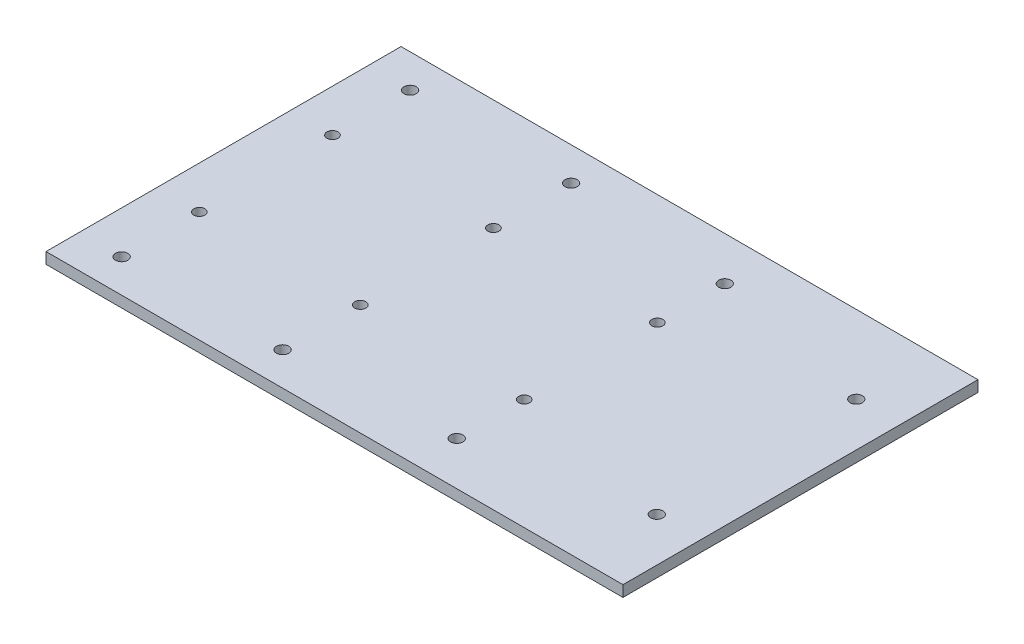
ISO-10303-21;
HEADER;
FILE_DESCRIPTION(('STEP AP214'),'2;1');
FILE_NAME('part.step','',(''),(''),'','','');
FILE_SCHEMA(('AUTOMOTIVE_DESIGN { 1 0 10303 214 1 1 1 1 }'));
ENDSEC;
DATA;
#1=APPLICATION_CONTEXT('core data for automotive mechanical design processes');
#2=APPLICATION_PROTOCOL_DEFINITION('international standard','automotive_design',2000,#1);
#3=PRODUCT_CONTEXT('',#1,'mechanical');
#4=PRODUCT('Part','Part','',(#3));
#5=PRODUCT_RELATED_PRODUCT_CATEGORY('part','',(#4));
#6=PRODUCT_DEFINITION_FORMATION('','',#4);
#7=PRODUCT_DEFINITION_CONTEXT('part definition',#1,'design');
#8=PRODUCT_DEFINITION('design','',#6,#7);
#9=PRODUCT_DEFINITION_SHAPE('','',#8);
#10=(LENGTH_UNIT() NAMED_UNIT(*) SI_UNIT(.MILLI.,.METRE.));
#11=(NAMED_UNIT(*) PLANE_ANGLE_UNIT() SI_UNIT($,.RADIAN.));
#12=(NAMED_UNIT(*) SI_UNIT($,.STERADIAN.) SOLID_ANGLE_UNIT());
#13=UNCERTAINTY_MEASURE_WITH_UNIT(LENGTH_MEASURE(1.E-05),#10,'distance_accuracy_value','');
#14=(GEOMETRIC_REPRESENTATION_CONTEXT(3) GLOBAL_UNCERTAINTY_ASSIGNED_CONTEXT((#13)) GLOBAL_UNIT_ASSIGNED_CONTEXT((#10,
#11,#12)) REPRESENTATION_CONTEXT('',''));
#15=CARTESIAN_POINT('',(0.,0.,0.));
#16=DIRECTION('',(0.,0.,1.));
#17=DIRECTION('',(1.,0.,0.));
#18=AXIS2_PLACEMENT_3D('',#15,#16,#17);
#19=CARTESIAN_POINT('',(165.1,6.35,101.6));
#20=DIRECTION('',(-1.,0.,0.));
#21=DIRECTION('',(0.,0.,1.));
#22=AXIS2_PLACEMENT_3D('',#19,#20,#21);
#23=PLANE('',#22);
#24=DIRECTION('',(0.,0.,-1.));
#25=VECTOR('',#24,1.);
#26=CARTESIAN_POINT('',(165.1,0.,101.6));
#27=LINE('',#26,#25);
#28=CARTESIAN_POINT('',(165.1,0.,101.6));
#29=VERTEX_POINT('',#28);
#30=CARTESIAN_POINT('',(165.1,0.,-101.6));
#31=VERTEX_POINT('',#30);
#32=EDGE_CURVE('E95',#29,#31,#27,.T.);
#33=ORIENTED_EDGE('',*,*,#32,.T.);
#34=DIRECTION('',(0.,-1.,0.));
#35=VECTOR('',#34,1.);
#36=CARTESIAN_POINT('',(165.1,6.35,-101.6));
#37=LINE('',#36,#35);
#38=CARTESIAN_POINT('',(165.1,6.35,-101.6));
#39=VERTEX_POINT('',#38);
#40=EDGE_CURVE('E11',#39,#31,#37,.T.);
#41=ORIENTED_EDGE('',*,*,#40,.F.);
#42=DIRECTION('',(0.,0.,-1.));
#43=VECTOR('',#42,1.);
#44=CARTESIAN_POINT('',(165.1,6.35,101.6));
#45=LINE('',#44,#43);
#46=CARTESIAN_POINT('',(165.1,6.35,101.6));
#47=VERTEX_POINT('',#46);
#48=EDGE_CURVE('E83',#47,#39,#45,.T.);
#49=ORIENTED_EDGE('',*,*,#48,.F.);
#50=DIRECTION('',(0.,-1.,0.));
#51=VECTOR('',#50,1.);
#52=CARTESIAN_POINT('',(165.1,6.35,101.6));
#53=LINE('',#52,#51);
#54=EDGE_CURVE('E91',#47,#29,#53,.T.);
#55=ORIENTED_EDGE('',*,*,#54,.T.);
#56=EDGE_LOOP('',(#33,#41,#49,#55));
#57=FACE_BOUND('',#56,.T.);
#58=ADVANCED_FACE('F32',(#57),#23,.F.);
#59=CARTESIAN_POINT('',(-165.1,6.35,-101.6));
#60=DIRECTION('',(0.,0.,1.));
#61=DIRECTION('',(1.,0.,0.));
#62=AXIS2_PLACEMENT_3D('',#59,#60,#61);
#63=PLANE('',#62);
#64=DIRECTION('',(-1.,0.,0.));
#65=VECTOR('',#64,1.);
#66=CARTESIAN_POINT('',(-165.1,0.,-101.6));
#67=LINE('',#66,#65);
#68=CARTESIAN_POINT('',(-165.1,0.,-101.6));
#69=VERTEX_POINT('',#68);
#70=EDGE_CURVE('E87',#31,#69,#67,.T.);
#71=ORIENTED_EDGE('',*,*,#70,.T.);
#72=DIRECTION('',(0.,-1.,0.));
#73=VECTOR('',#72,1.);
#74=CARTESIAN_POINT('',(-165.1,6.35,-101.6));
#75=LINE('',#74,#73);
#76=CARTESIAN_POINT('',(-165.1,6.35,-101.6));
#77=VERTEX_POINT('',#76);
#78=EDGE_CURVE('E40',#77,#69,#75,.T.);
#79=ORIENTED_EDGE('',*,*,#78,.F.);
#80=DIRECTION('',(-1.,0.,0.));
#81=VECTOR('',#80,1.);
#82=CARTESIAN_POINT('',(-165.1,6.35,-101.6));
#83=LINE('',#82,#81);
#84=EDGE_CURVE('E78',#39,#77,#83,.T.);
#85=ORIENTED_EDGE('',*,*,#84,.F.);
#86=ORIENTED_EDGE('',*,*,#40,.T.);
#87=EDGE_LOOP('',(#71,#79,#85,#86));
#88=FACE_BOUND('',#87,.T.);
#89=ADVANCED_FACE('F86',(#88),#63,.F.);
#90=CARTESIAN_POINT('',(-165.1,6.35,101.6));
#91=DIRECTION('',(1.,0.,0.));
#92=DIRECTION('',(0.,0.,-1.));
#93=AXIS2_PLACEMENT_3D('',#90,#91,#92);
#94=PLANE('',#93);
#95=DIRECTION('',(0.,0.,1.));
#96=VECTOR('',#95,1.);
#97=CARTESIAN_POINT('',(-165.1,0.,101.6));
#98=LINE('',#97,#96);
#99=CARTESIAN_POINT('',(-165.1,0.,101.6));
#100=VERTEX_POINT('',#99);
#101=EDGE_CURVE('E65',#69,#100,#98,.T.);
#102=ORIENTED_EDGE('',*,*,#101,.T.);
#103=DIRECTION('',(0.,-1.,0.));
#104=VECTOR('',#103,1.);
#105=CARTESIAN_POINT('',(-165.1,6.35,101.6));
#106=LINE('',#105,#104);
#107=CARTESIAN_POINT('',(-165.1,6.35,101.6));
#108=VERTEX_POINT('',#107);
#109=EDGE_CURVE('E88',#108,#100,#106,.T.);
#110=ORIENTED_EDGE('',*,*,#109,.F.);
#111=DIRECTION('',(0.,0.,1.));
#112=VECTOR('',#111,1.);
#113=CARTESIAN_POINT('',(-165.1,6.35,101.6));
#114=LINE('',#113,#112);
#115=EDGE_CURVE('E81',#77,#108,#114,.T.);
#116=ORIENTED_EDGE('',*,*,#115,.F.);
#117=ORIENTED_EDGE('',*,*,#78,.T.);
#118=EDGE_LOOP('',(#102,#110,#116,#117));
#119=FACE_BOUND('',#118,.T.);
#120=ADVANCED_FACE('F89',(#119),#94,.F.);
#121=CARTESIAN_POINT('',(-165.1,6.35,101.6));
#122=DIRECTION('',(0.,0.,-1.));
#123=DIRECTION('',(-1.,0.,0.));
#124=AXIS2_PLACEMENT_3D('',#121,#122,#123);
#125=PLANE('',#124);
#126=DIRECTION('',(1.,0.,0.));
#127=VECTOR('',#126,1.);
#128=CARTESIAN_POINT('',(-165.1,0.,101.6));
#129=LINE('',#128,#127);
#130=EDGE_CURVE('E71',#100,#29,#129,.T.);
#131=ORIENTED_EDGE('',*,*,#130,.T.);
#132=ORIENTED_EDGE('',*,*,#54,.F.);
#133=DIRECTION('',(1.,0.,0.));
#134=VECTOR('',#133,1.);
#135=CARTESIAN_POINT('',(-165.1,6.35,101.6));
#136=LINE('',#135,#134);
#137=EDGE_CURVE('E48',#108,#47,#136,.T.);
#138=ORIENTED_EDGE('',*,*,#137,.F.);
#139=ORIENTED_EDGE('',*,*,#109,.T.);
#140=EDGE_LOOP('',(#131,#132,#138,#139));
#141=FACE_BOUND('',#140,.T.);
#142=ADVANCED_FACE('F103',(#141),#125,.F.);
#143=CARTESIAN_POINT('',(0.,6.35,0.));
#144=DIRECTION('',(0.,-1.,0.));
#145=DIRECTION('',(0.,0.,-1.));
#146=AXIS2_PLACEMENT_3D('',#143,#144,#145);
#147=PLANE('',#146);
#148=CARTESIAN_POINT('',(-140.851562594,6.35,-82.5499999999999));
#149=DIRECTION('',(0.,1.,0.));
#150=DIRECTION('',(0.,0.,1.));
#151=AXIS2_PLACEMENT_3D('',#148,#149,#150);
#152=CIRCLE('',#151,3.5);
#153=CARTESIAN_POINT('',(-140.851562594,6.35,-79.0499999999999));
#154=VERTEX_POINT('',#153);
#155=EDGE_CURVE('E189',#154,#154,#152,.T.);
#156=ORIENTED_EDGE('',*,*,#155,.F.);
#157=EDGE_LOOP('',(#156));
#158=FACE_BOUND('',#157,.T.);
#159=CARTESIAN_POINT('',(-48.7159251880002,6.35,-82.5499999999999));
#160=DIRECTION('',(0.,1.,0.));
#161=DIRECTION('',(0.,0.,1.));
#162=AXIS2_PLACEMENT_3D('',#159,#160,#161);
#163=CIRCLE('',#162,3.5);
#164=CARTESIAN_POINT('',(-48.7159251880002,6.35,-79.05));
#165=VERTEX_POINT('',#164);
#166=EDGE_CURVE('E183',#165,#165,#163,.T.);
#167=ORIENTED_EDGE('',*,*,#166,.F.);
#168=EDGE_LOOP('',(#167));
#169=FACE_BOUND('',#168,.T.);
#170=CARTESIAN_POINT('',(45.084074812,6.35,-76.7010000288686));
#171=DIRECTION('',(0.,1.,0.));
#172=DIRECTION('',(0.,0.,1.));
#173=AXIS2_PLACEMENT_3D('',#170,#171,#172);
#174=CIRCLE('',#173,3.5);
#175=CARTESIAN_POINT('',(45.084074812,6.35,-73.2010000288686));
#176=VERTEX_POINT('',#175);
#177=EDGE_CURVE('E177',#176,#176,#174,.T.);
#178=ORIENTED_EDGE('',*,*,#177,.F.);
#179=EDGE_LOOP('',(#178));
#180=FACE_BOUND('',#179,.T.);
#181=CARTESIAN_POINT('',(45.084074812,6.35,76.6989999711314));
#182=DIRECTION('',(0.,1.,0.));
#183=DIRECTION('',(0.,0.,1.));
#184=AXIS2_PLACEMENT_3D('',#181,#182,#183);
#185=CIRCLE('',#184,3.5);
#186=CARTESIAN_POINT('',(45.084074812,6.35,80.1989999711314));
#187=VERTEX_POINT('',#186);
#188=EDGE_CURVE('E171',#187,#187,#185,.T.);
#189=ORIENTED_EDGE('',*,*,#188,.F.);
#190=EDGE_LOOP('',(#189));
#191=FACE_BOUND('',#190,.T.);
#192=CARTESIAN_POINT('',(-48.715925188,6.35,82.5500000000001));
#193=DIRECTION('',(0.,1.,0.));
#194=DIRECTION('',(0.,0.,1.));
#195=AXIS2_PLACEMENT_3D('',#192,#193,#194);
#196=CIRCLE('',#195,3.5);
#197=CARTESIAN_POINT('',(-48.715925188,6.35,86.0500000000001));
#198=VERTEX_POINT('',#197);
#199=EDGE_CURVE('E165',#198,#198,#196,.T.);
#200=ORIENTED_EDGE('',*,*,#199,.F.);
#201=EDGE_LOOP('',(#200));
#202=FACE_BOUND('',#201,.T.);
#203=CARTESIAN_POINT('',(-140.851562594,6.35,82.5500000000002));
#204=DIRECTION('',(0.,1.,0.));
#205=DIRECTION('',(0.,0.,1.));
#206=AXIS2_PLACEMENT_3D('',#203,#204,#205);
#207=CIRCLE('',#206,3.5);
#208=CARTESIAN_POINT('',(-140.851562594,6.35,86.0500000000002));
#209=VERTEX_POINT('',#208);
#210=EDGE_CURVE('E159',#209,#209,#207,.T.);
#211=ORIENTED_EDGE('',*,*,#210,.F.);
#212=EDGE_LOOP('',(#211));
#213=FACE_BOUND('',#212,.T.);
#214=CARTESIAN_POINT('',(139.954074812,6.35,-57.0720427209116));
#215=DIRECTION('',(0.,1.,0.));
#216=DIRECTION('',(0.,0.,1.));
#217=AXIS2_PLACEMENT_3D('',#214,#215,#216);
#218=CIRCLE('',#217,3.5);
#219=CARTESIAN_POINT('',(139.954074812,6.35,-53.5720427209116));
#220=VERTEX_POINT('',#219);
#221=EDGE_CURVE('E153',#220,#220,#218,.T.);
#222=ORIENTED_EDGE('',*,*,#221,.F.);
#223=EDGE_LOOP('',(#222));
#224=FACE_BOUND('',#223,.T.);
#225=CARTESIAN_POINT('',(139.954074812,6.35,57.0720427209118));
#226=DIRECTION('',(0.,1.,0.));
#227=DIRECTION('',(0.,0.,1.));
#228=AXIS2_PLACEMENT_3D('',#225,#226,#227);
#229=CIRCLE('',#228,3.5);
#230=CARTESIAN_POINT('',(139.954074812,6.35,60.5720427209118));
#231=VERTEX_POINT('',#230);
#232=EDGE_CURVE('E147',#231,#231,#229,.T.);
#233=ORIENTED_EDGE('',*,*,#232,.F.);
#234=EDGE_LOOP('',(#233));
#235=FACE_BOUND('',#234,.T.);
#236=CARTESIAN_POINT('',(-140.851767509531,6.35,-38.0999999994488));
#237=DIRECTION('',(0.,1.,0.));
#238=DIRECTION('',(0.,0.,1.));
#239=AXIS2_PLACEMENT_3D('',#236,#237,#238);
#240=CIRCLE('',#239,3.17499999999998);
#241=CARTESIAN_POINT('',(-140.851767509531,6.35,-34.9249999994488));
#242=VERTEX_POINT('',#241);
#243=EDGE_CURVE('E141',#242,#242,#240,.T.);
#244=ORIENTED_EDGE('',*,*,#243,.F.);
#245=EDGE_LOOP('',(#244));
#246=FACE_BOUND('',#245,.T.);
#247=CARTESIAN_POINT('',(-140.851357678469,6.35,38.0999999994491));
#248=DIRECTION('',(0.,1.,0.));
#249=DIRECTION('',(0.,0.,1.));
#250=AXIS2_PLACEMENT_3D('',#247,#248,#249);
#251=CIRCLE('',#250,3.17499999999998);
#252=CARTESIAN_POINT('',(-140.851357678469,6.35,41.2749999994491));
#253=VERTEX_POINT('',#252);
#254=EDGE_CURVE('E135',#253,#253,#251,.T.);
#255=ORIENTED_EDGE('',*,*,#254,.F.);
#256=EDGE_LOOP('',(#255));
#257=FACE_BOUND('',#256,.T.);
#258=CARTESIAN_POINT('',(-48.7159251880001,6.35,38.0995044618878));
#259=DIRECTION('',(0.,1.,0.));
#260=DIRECTION('',(0.,0.,1.));
#261=AXIS2_PLACEMENT_3D('',#258,#259,#260);
#262=CIRCLE('',#261,3.17499999999998);
#263=CARTESIAN_POINT('',(-48.7159251880001,6.35,41.2745044618878));
#264=VERTEX_POINT('',#263);
#265=EDGE_CURVE('E129',#264,#264,#262,.T.);
#266=ORIENTED_EDGE('',*,*,#265,.F.);
#267=EDGE_LOOP('',(#266));
#268=FACE_BOUND('',#267,.T.);
#269=CARTESIAN_POINT('',(-48.7159251880002,6.35,-38.1004955392143));
#270=DIRECTION('',(0.,1.,0.));
#271=DIRECTION('',(0.,0.,1.));
#272=AXIS2_PLACEMENT_3D('',#269,#270,#271);
#273=CIRCLE('',#272,3.17499999999998);
#274=CARTESIAN_POINT('',(-48.7159251880002,6.35,-34.9254955392144));
#275=VERTEX_POINT('',#274);
#276=EDGE_CURVE('E123',#275,#275,#273,.T.);
#277=ORIENTED_EDGE('',*,*,#276,.F.);
#278=EDGE_LOOP('',(#277));
#279=FACE_BOUND('',#278,.T.);
#280=CARTESIAN_POINT('',(45.0838698964688,6.35,-38.1010000283175));
#281=DIRECTION('',(0.,1.,0.));
#282=DIRECTION('',(0.,0.,1.));
#283=AXIS2_PLACEMENT_3D('',#280,#281,#282);
#284=CIRCLE('',#283,3.17499999999998);
#285=CARTESIAN_POINT('',(45.0838698964688,6.35,-34.9260000283176));
#286=VERTEX_POINT('',#285);
#287=EDGE_CURVE('E117',#286,#286,#284,.T.);
#288=ORIENTED_EDGE('',*,*,#287,.F.);
#289=EDGE_LOOP('',(#288));
#290=FACE_BOUND('',#289,.T.);
#291=CARTESIAN_POINT('',(45.0842797275312,6.35,38.0989999705804));
#292=DIRECTION('',(0.,1.,0.));
#293=DIRECTION('',(0.,0.,1.));
#294=AXIS2_PLACEMENT_3D('',#291,#292,#293);
#295=CIRCLE('',#294,3.17499999999998);
#296=CARTESIAN_POINT('',(45.0842797275312,6.35,41.2739999705803));
#297=VERTEX_POINT('',#296);
#298=EDGE_CURVE('E111',#297,#297,#295,.T.);
#299=ORIENTED_EDGE('',*,*,#298,.F.);
#300=EDGE_LOOP('',(#299));
#301=FACE_BOUND('',#300,.T.);
#302=ORIENTED_EDGE('',*,*,#48,.T.);
#303=ORIENTED_EDGE('',*,*,#84,.T.);
#304=ORIENTED_EDGE('',*,*,#115,.T.);
#305=ORIENTED_EDGE('',*,*,#137,.T.);
#306=EDGE_LOOP('',(#302,#303,#304,#305));
#307=FACE_BOUND('',#306,.T.);
#308=ADVANCED_FACE('F79',(#158,#169,#180,#191,#202,#213,#224,#235,#246,#257,#268,#279,#290,#301,
#307),#147,.F.);
#309=CARTESIAN_POINT('',(0.,0.,0.));
#310=DIRECTION('',(0.,-1.,0.));
#311=DIRECTION('',(0.,0.,-1.));
#312=AXIS2_PLACEMENT_3D('',#309,#310,#311);
#313=PLANE('',#312);
#314=CARTESIAN_POINT('',(-140.851562594,0.,-82.5499999999999));
#315=DIRECTION('',(0.,1.,0.));
#316=DIRECTION('',(0.,0.,1.));
#317=AXIS2_PLACEMENT_3D('',#314,#315,#316);
#318=CIRCLE('',#317,3.5);
#319=CARTESIAN_POINT('',(-140.851562594,0.,-79.0499999999999));
#320=VERTEX_POINT('',#319);
#321=EDGE_CURVE('E186',#320,#320,#318,.T.);
#322=ORIENTED_EDGE('',*,*,#321,.T.);
#323=EDGE_LOOP('',(#322));
#324=FACE_BOUND('',#323,.T.);
#325=CARTESIAN_POINT('',(-48.7159251880002,0.,-82.5499999999999));
#326=DIRECTION('',(0.,1.,0.));
#327=DIRECTION('',(0.,0.,1.));
#328=AXIS2_PLACEMENT_3D('',#325,#326,#327);
#329=CIRCLE('',#328,3.5);
#330=CARTESIAN_POINT('',(-48.7159251880002,0.,-79.05));
#331=VERTEX_POINT('',#330);
#332=EDGE_CURVE('E180',#331,#331,#329,.T.);
#333=ORIENTED_EDGE('',*,*,#332,.T.);
#334=EDGE_LOOP('',(#333));
#335=FACE_BOUND('',#334,.T.);
#336=CARTESIAN_POINT('',(45.084074812,0.,-76.7010000288686));
#337=DIRECTION('',(0.,1.,0.));
#338=DIRECTION('',(0.,0.,1.));
#339=AXIS2_PLACEMENT_3D('',#336,#337,#338);
#340=CIRCLE('',#339,3.5);
#341=CARTESIAN_POINT('',(45.084074812,0.,-73.2010000288686));
#342=VERTEX_POINT('',#341);
#343=EDGE_CURVE('E174',#342,#342,#340,.T.);
#344=ORIENTED_EDGE('',*,*,#343,.T.);
#345=EDGE_LOOP('',(#344));
#346=FACE_BOUND('',#345,.T.);
#347=CARTESIAN_POINT('',(45.084074812,0.,76.6989999711314));
#348=DIRECTION('',(0.,1.,0.));
#349=DIRECTION('',(0.,0.,1.));
#350=AXIS2_PLACEMENT_3D('',#347,#348,#349);
#351=CIRCLE('',#350,3.5);
#352=CARTESIAN_POINT('',(45.084074812,0.,80.1989999711314));
#353=VERTEX_POINT('',#352);
#354=EDGE_CURVE('E168',#353,#353,#351,.T.);
#355=ORIENTED_EDGE('',*,*,#354,.T.);
#356=EDGE_LOOP('',(#355));
#357=FACE_BOUND('',#356,.T.);
#358=CARTESIAN_POINT('',(-48.715925188,0.,82.5500000000001));
#359=DIRECTION('',(0.,1.,0.));
#360=DIRECTION('',(0.,0.,1.));
#361=AXIS2_PLACEMENT_3D('',#358,#359,#360);
#362=CIRCLE('',#361,3.5);
#363=CARTESIAN_POINT('',(-48.715925188,0.,86.0500000000001));
#364=VERTEX_POINT('',#363);
#365=EDGE_CURVE('E162',#364,#364,#362,.T.);
#366=ORIENTED_EDGE('',*,*,#365,.T.);
#367=EDGE_LOOP('',(#366));
#368=FACE_BOUND('',#367,.T.);
#369=CARTESIAN_POINT('',(-140.851562594,0.,82.5500000000002));
#370=DIRECTION('',(0.,1.,0.));
#371=DIRECTION('',(0.,0.,1.));
#372=AXIS2_PLACEMENT_3D('',#369,#370,#371);
#373=CIRCLE('',#372,3.5);
#374=CARTESIAN_POINT('',(-140.851562594,0.,86.0500000000002));
#375=VERTEX_POINT('',#374);
#376=EDGE_CURVE('E156',#375,#375,#373,.T.);
#377=ORIENTED_EDGE('',*,*,#376,.T.);
#378=EDGE_LOOP('',(#377));
#379=FACE_BOUND('',#378,.T.);
#380=CARTESIAN_POINT('',(139.954074812,0.,-57.0720427209116));
#381=DIRECTION('',(0.,1.,0.));
#382=DIRECTION('',(0.,0.,1.));
#383=AXIS2_PLACEMENT_3D('',#380,#381,#382);
#384=CIRCLE('',#383,3.5);
#385=CARTESIAN_POINT('',(139.954074812,0.,-53.5720427209116));
#386=VERTEX_POINT('',#385);
#387=EDGE_CURVE('E150',#386,#386,#384,.T.);
#388=ORIENTED_EDGE('',*,*,#387,.T.);
#389=EDGE_LOOP('',(#388));
#390=FACE_BOUND('',#389,.T.);
#391=CARTESIAN_POINT('',(139.954074812,0.,57.0720427209118));
#392=DIRECTION('',(0.,1.,0.));
#393=DIRECTION('',(0.,0.,1.));
#394=AXIS2_PLACEMENT_3D('',#391,#392,#393);
#395=CIRCLE('',#394,3.5);
#396=CARTESIAN_POINT('',(139.954074812,0.,60.5720427209118));
#397=VERTEX_POINT('',#396);
#398=EDGE_CURVE('E144',#397,#397,#395,.T.);
#399=ORIENTED_EDGE('',*,*,#398,.T.);
#400=EDGE_LOOP('',(#399));
#401=FACE_BOUND('',#400,.T.);
#402=CARTESIAN_POINT('',(-140.851767509531,0.,-38.0999999994488));
#403=DIRECTION('',(0.,1.,0.));
#404=DIRECTION('',(0.,0.,1.));
#405=AXIS2_PLACEMENT_3D('',#402,#403,#404);
#406=CIRCLE('',#405,3.17499999999998);
#407=CARTESIAN_POINT('',(-140.851767509531,0.,-34.9249999994488));
#408=VERTEX_POINT('',#407);
#409=EDGE_CURVE('E138',#408,#408,#406,.T.);
#410=ORIENTED_EDGE('',*,*,#409,.T.);
#411=EDGE_LOOP('',(#410));
#412=FACE_BOUND('',#411,.T.);
#413=CARTESIAN_POINT('',(-140.851357678469,0.,38.0999999994491));
#414=DIRECTION('',(0.,1.,0.));
#415=DIRECTION('',(0.,0.,1.));
#416=AXIS2_PLACEMENT_3D('',#413,#414,#415);
#417=CIRCLE('',#416,3.17499999999998);
#418=CARTESIAN_POINT('',(-140.851357678469,0.,41.2749999994491));
#419=VERTEX_POINT('',#418);
#420=EDGE_CURVE('E132',#419,#419,#417,.T.);
#421=ORIENTED_EDGE('',*,*,#420,.T.);
#422=EDGE_LOOP('',(#421));
#423=FACE_BOUND('',#422,.T.);
#424=CARTESIAN_POINT('',(-48.7159251880001,0.,38.0995044618878));
#425=DIRECTION('',(0.,1.,0.));
#426=DIRECTION('',(0.,0.,1.));
#427=AXIS2_PLACEMENT_3D('',#424,#425,#426);
#428=CIRCLE('',#427,3.175);
#429=CARTESIAN_POINT('',(-48.7159251880001,0.,41.2745044618878));
#430=VERTEX_POINT('',#429);
#431=EDGE_CURVE('E126',#430,#430,#428,.T.);
#432=ORIENTED_EDGE('',*,*,#431,.T.);
#433=EDGE_LOOP('',(#432));
#434=FACE_BOUND('',#433,.T.);
#435=CARTESIAN_POINT('',(-48.7159251880002,0.,-38.1004955392143));
#436=DIRECTION('',(0.,1.,0.));
#437=DIRECTION('',(0.,0.,1.));
#438=AXIS2_PLACEMENT_3D('',#435,#436,#437);
#439=CIRCLE('',#438,3.175);
#440=CARTESIAN_POINT('',(-48.7159251880002,0.,-34.9254955392143));
#441=VERTEX_POINT('',#440);
#442=EDGE_CURVE('E120',#441,#441,#439,.T.);
#443=ORIENTED_EDGE('',*,*,#442,.T.);
#444=EDGE_LOOP('',(#443));
#445=FACE_BOUND('',#444,.T.);
#446=CARTESIAN_POINT('',(45.0838698964688,0.,-38.1010000283175));
#447=DIRECTION('',(0.,1.,0.));
#448=DIRECTION('',(0.,0.,1.));
#449=AXIS2_PLACEMENT_3D('',#446,#447,#448);
#450=CIRCLE('',#449,3.175);
#451=CARTESIAN_POINT('',(45.0838698964688,0.,-34.9260000283175));
#452=VERTEX_POINT('',#451);
#453=EDGE_CURVE('E114',#452,#452,#450,.T.);
#454=ORIENTED_EDGE('',*,*,#453,.T.);
#455=EDGE_LOOP('',(#454));
#456=FACE_BOUND('',#455,.T.);
#457=CARTESIAN_POINT('',(45.0842797275312,0.,38.0989999705804));
#458=DIRECTION('',(0.,1.,0.));
#459=DIRECTION('',(0.,0.,1.));
#460=AXIS2_PLACEMENT_3D('',#457,#458,#459);
#461=CIRCLE('',#460,3.175);
#462=CARTESIAN_POINT('',(45.0842797275312,0.,41.2739999705803));
#463=VERTEX_POINT('',#462);
#464=EDGE_CURVE('E98',#463,#463,#461,.T.);
#465=ORIENTED_EDGE('',*,*,#464,.T.);
#466=EDGE_LOOP('',(#465));
#467=FACE_BOUND('',#466,.T.);
#468=ORIENTED_EDGE('',*,*,#32,.F.);
#469=ORIENTED_EDGE('',*,*,#130,.F.);
#470=ORIENTED_EDGE('',*,*,#101,.F.);
#471=ORIENTED_EDGE('',*,*,#70,.F.);
#472=EDGE_LOOP('',(#468,#469,#470,#471));
#473=FACE_BOUND('',#472,.T.);
#474=ADVANCED_FACE('F106',(#324,#335,#346,#357,#368,#379,#390,#401,#412,#423,#434,#445,#456,
#467,#473),#313,.T.);
#475=CARTESIAN_POINT('',(45.0842797275312,6.35,38.0989999705804));
#476=DIRECTION('',(0.,1.,0.));
#477=DIRECTION('',(0.,0.,1.));
#478=AXIS2_PLACEMENT_3D('',#475,#476,#477);
#479=CYLINDRICAL_SURFACE('',#478,3.17499999999999);
#480=ORIENTED_EDGE('',*,*,#464,.F.);
#481=EDGE_LOOP('',(#480));
#482=FACE_BOUND('',#481,.T.);
#483=ORIENTED_EDGE('',*,*,#298,.T.);
#484=EDGE_LOOP('',(#483));
#485=FACE_BOUND('',#484,.T.);
#486=ADVANCED_FACE('F224',(#482,#485),#479,.F.);
#487=CARTESIAN_POINT('',(45.0838698964688,6.35,-38.1010000283175));
#488=DIRECTION('',(0.,1.,0.));
#489=DIRECTION('',(0.,0.,1.));
#490=AXIS2_PLACEMENT_3D('',#487,#488,#489);
#491=CYLINDRICAL_SURFACE('',#490,3.17499999999999);
#492=ORIENTED_EDGE('',*,*,#453,.F.);
#493=EDGE_LOOP('',(#492));
#494=FACE_BOUND('',#493,.T.);
#495=ORIENTED_EDGE('',*,*,#287,.T.);
#496=EDGE_LOOP('',(#495));
#497=FACE_BOUND('',#496,.T.);
#498=ADVANCED_FACE('F226',(#494,#497),#491,.F.);
#499=CARTESIAN_POINT('',(-48.7159251880002,6.35,-38.1004955392143));
#500=DIRECTION('',(0.,1.,0.));
#501=DIRECTION('',(0.,0.,1.));
#502=AXIS2_PLACEMENT_3D('',#499,#500,#501);
#503=CYLINDRICAL_SURFACE('',#502,3.17499999999999);
#504=ORIENTED_EDGE('',*,*,#442,.F.);
#505=EDGE_LOOP('',(#504));
#506=FACE_BOUND('',#505,.T.);
#507=ORIENTED_EDGE('',*,*,#276,.T.);
#508=EDGE_LOOP('',(#507));
#509=FACE_BOUND('',#508,.T.);
#510=ADVANCED_FACE('F233',(#506,#509),#503,.F.);
#511=CARTESIAN_POINT('',(-48.7159251880001,6.35,38.0995044618878));
#512=DIRECTION('',(0.,1.,0.));
#513=DIRECTION('',(0.,0.,1.));
#514=AXIS2_PLACEMENT_3D('',#511,#512,#513);
#515=CYLINDRICAL_SURFACE('',#514,3.17499999999999);
#516=ORIENTED_EDGE('',*,*,#431,.F.);
#517=EDGE_LOOP('',(#516));
#518=FACE_BOUND('',#517,.T.);
#519=ORIENTED_EDGE('',*,*,#265,.T.);
#520=EDGE_LOOP('',(#519));
#521=FACE_BOUND('',#520,.T.);
#522=ADVANCED_FACE('F358',(#518,#521),#515,.F.);
#523=CARTESIAN_POINT('',(-140.851357678469,6.35,38.0999999994491));
#524=DIRECTION('',(0.,1.,0.));
#525=DIRECTION('',(0.,0.,1.));
#526=AXIS2_PLACEMENT_3D('',#523,#524,#525);
#527=CYLINDRICAL_SURFACE('',#526,3.17499999999998);
#528=ORIENTED_EDGE('',*,*,#420,.F.);
#529=EDGE_LOOP('',(#528));
#530=FACE_BOUND('',#529,.T.);
#531=ORIENTED_EDGE('',*,*,#254,.T.);
#532=EDGE_LOOP('',(#531));
#533=FACE_BOUND('',#532,.T.);
#534=ADVANCED_FACE('F354',(#530,#533),#527,.F.);
#535=CARTESIAN_POINT('',(-140.851767509531,6.35,-38.0999999994488));
#536=DIRECTION('',(0.,1.,0.));
#537=DIRECTION('',(0.,0.,1.));
#538=AXIS2_PLACEMENT_3D('',#535,#536,#537);
#539=CYLINDRICAL_SURFACE('',#538,3.17499999999998);
#540=ORIENTED_EDGE('',*,*,#409,.F.);
#541=EDGE_LOOP('',(#540));
#542=FACE_BOUND('',#541,.T.);
#543=ORIENTED_EDGE('',*,*,#243,.T.);
#544=EDGE_LOOP('',(#543));
#545=FACE_BOUND('',#544,.T.);
#546=ADVANCED_FACE('F276',(#542,#545),#539,.F.);
#547=CARTESIAN_POINT('',(139.954074812,6.35,57.0720427209118));
#548=DIRECTION('',(0.,1.,0.));
#549=DIRECTION('',(0.,0.,1.));
#550=AXIS2_PLACEMENT_3D('',#547,#548,#549);
#551=CYLINDRICAL_SURFACE('',#550,3.5);
#552=ORIENTED_EDGE('',*,*,#398,.F.);
#553=EDGE_LOOP('',(#552));
#554=FACE_BOUND('',#553,.T.);
#555=ORIENTED_EDGE('',*,*,#232,.T.);
#556=EDGE_LOOP('',(#555));
#557=FACE_BOUND('',#556,.T.);
#558=ADVANCED_FACE('F270',(#554,#557),#551,.F.);
#559=CARTESIAN_POINT('',(139.954074812,6.35,-57.0720427209116));
#560=DIRECTION('',(0.,1.,0.));
#561=DIRECTION('',(0.,0.,1.));
#562=AXIS2_PLACEMENT_3D('',#559,#560,#561);
#563=CYLINDRICAL_SURFACE('',#562,3.5);
#564=ORIENTED_EDGE('',*,*,#387,.F.);
#565=EDGE_LOOP('',(#564));
#566=FACE_BOUND('',#565,.T.);
#567=ORIENTED_EDGE('',*,*,#221,.T.);
#568=EDGE_LOOP('',(#567));
#569=FACE_BOUND('',#568,.T.);
#570=ADVANCED_FACE('F275',(#566,#569),#563,.F.);
#571=CARTESIAN_POINT('',(-140.851562594,6.35,82.5500000000002));
#572=DIRECTION('',(0.,1.,0.));
#573=DIRECTION('',(0.,0.,1.));
#574=AXIS2_PLACEMENT_3D('',#571,#572,#573);
#575=CYLINDRICAL_SURFACE('',#574,3.5);
#576=ORIENTED_EDGE('',*,*,#376,.F.);
#577=EDGE_LOOP('',(#576));
#578=FACE_BOUND('',#577,.T.);
#579=ORIENTED_EDGE('',*,*,#210,.T.);
#580=EDGE_LOOP('',(#579));
#581=FACE_BOUND('',#580,.T.);
#582=ADVANCED_FACE('F288',(#578,#581),#575,.F.);
#583=CARTESIAN_POINT('',(-48.715925188,6.35,82.5500000000001));
#584=DIRECTION('',(0.,1.,0.));
#585=DIRECTION('',(0.,0.,1.));
#586=AXIS2_PLACEMENT_3D('',#583,#584,#585);
#587=CYLINDRICAL_SURFACE('',#586,3.5);
#588=ORIENTED_EDGE('',*,*,#365,.F.);
#589=EDGE_LOOP('',(#588));
#590=FACE_BOUND('',#589,.T.);
#591=ORIENTED_EDGE('',*,*,#199,.T.);
#592=EDGE_LOOP('',(#591));
#593=FACE_BOUND('',#592,.T.);
#594=ADVANCED_FACE('F298',(#590,#593),#587,.F.);
#595=CARTESIAN_POINT('',(45.084074812,6.35,76.6989999711314));
#596=DIRECTION('',(0.,1.,0.));
#597=DIRECTION('',(0.,0.,1.));
#598=AXIS2_PLACEMENT_3D('',#595,#596,#597);
#599=CYLINDRICAL_SURFACE('',#598,3.5);
#600=ORIENTED_EDGE('',*,*,#354,.F.);
#601=EDGE_LOOP('',(#600));
#602=FACE_BOUND('',#601,.T.);
#603=ORIENTED_EDGE('',*,*,#188,.T.);
#604=EDGE_LOOP('',(#603));
#605=FACE_BOUND('',#604,.T.);
#606=ADVANCED_FACE('F308',(#602,#605),#599,.F.);
#607=CARTESIAN_POINT('',(45.084074812,6.35,-76.7010000288686));
#608=DIRECTION('',(0.,1.,0.));
#609=DIRECTION('',(0.,0.,1.));
#610=AXIS2_PLACEMENT_3D('',#607,#608,#609);
#611=CYLINDRICAL_SURFACE('',#610,3.5);
#612=ORIENTED_EDGE('',*,*,#343,.F.);
#613=EDGE_LOOP('',(#612));
#614=FACE_BOUND('',#613,.T.);
#615=ORIENTED_EDGE('',*,*,#177,.T.);
#616=EDGE_LOOP('',(#615));
#617=FACE_BOUND('',#616,.T.);
#618=ADVANCED_FACE('F318',(#614,#617),#611,.F.);
#619=CARTESIAN_POINT('',(-48.7159251880002,6.35,-82.5499999999999));
#620=DIRECTION('',(0.,1.,0.));
#621=DIRECTION('',(0.,0.,1.));
#622=AXIS2_PLACEMENT_3D('',#619,#620,#621);
#623=CYLINDRICAL_SURFACE('',#622,3.5);
#624=ORIENTED_EDGE('',*,*,#332,.F.);
#625=EDGE_LOOP('',(#624));
#626=FACE_BOUND('',#625,.T.);
#627=ORIENTED_EDGE('',*,*,#166,.T.);
#628=EDGE_LOOP('',(#627));
#629=FACE_BOUND('',#628,.T.);
#630=ADVANCED_FACE('F328',(#626,#629),#623,.F.);
#631=CARTESIAN_POINT('',(-140.851562594,6.35,-82.5499999999999));
#632=DIRECTION('',(0.,1.,0.));
#633=DIRECTION('',(0.,0.,1.));
#634=AXIS2_PLACEMENT_3D('',#631,#632,#633);
#635=CYLINDRICAL_SURFACE('',#634,3.5);
#636=ORIENTED_EDGE('',*,*,#321,.F.);
#637=EDGE_LOOP('',(#636));
#638=FACE_BOUND('',#637,.T.);
#639=ORIENTED_EDGE('',*,*,#155,.T.);
#640=EDGE_LOOP('',(#639));
#641=FACE_BOUND('',#640,.T.);
#642=ADVANCED_FACE('F193',(#638,#641),#635,.F.);
#643=CLOSED_SHELL('',(#58,#89,#120,#142,#308,#474,#486,#498,#510,#522,#534,#546,#558,#570,#582,
#594,#606,#618,#630,#642));
#644=MANIFOLD_SOLID_BREP('B2',#643);
#645=ADVANCED_BREP_SHAPE_REPRESENTATION('',(#18,#644),#14);
#646=SHAPE_DEFINITION_REPRESENTATION(#9,#645);
ENDSEC;
END-ISO-10303-21;
